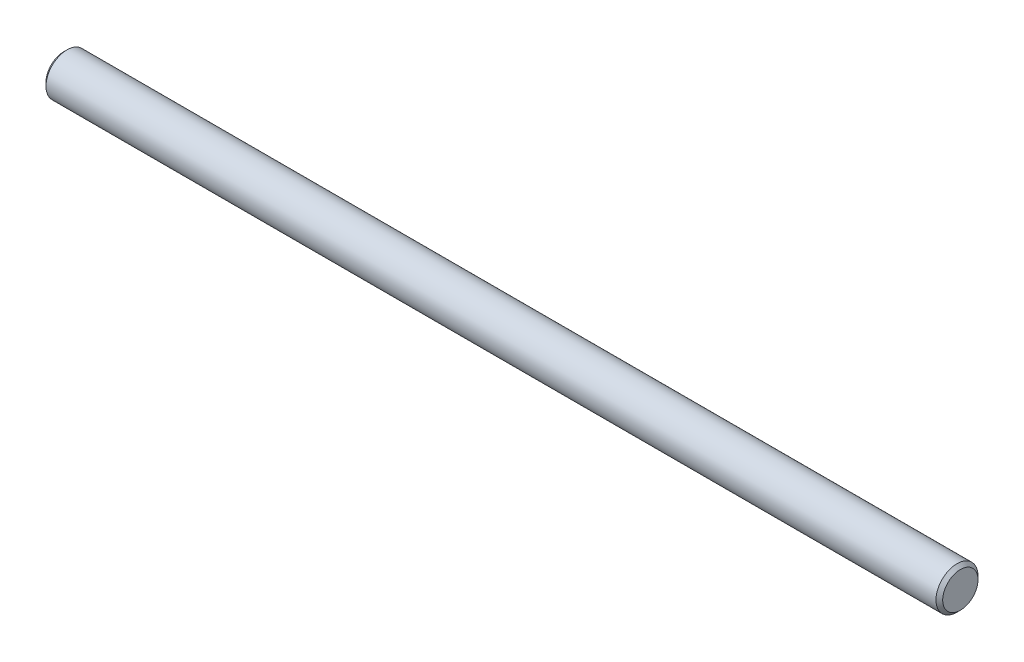
ISO-10303-21;
HEADER;
FILE_DESCRIPTION(('STEP AP214'),'2;1');
FILE_NAME('part.step','',(''),(''),'','','');
FILE_SCHEMA(('AUTOMOTIVE_DESIGN { 1 0 10303 214 1 1 1 1 }'));
ENDSEC;
DATA;
#1=APPLICATION_CONTEXT('core data for automotive mechanical design processes');
#2=APPLICATION_PROTOCOL_DEFINITION('international standard','automotive_design',2000,#1);
#3=PRODUCT_CONTEXT('',#1,'mechanical');
#4=PRODUCT('Part','Part','',(#3));
#5=PRODUCT_RELATED_PRODUCT_CATEGORY('part','',(#4));
#6=PRODUCT_DEFINITION_FORMATION('','',#4);
#7=PRODUCT_DEFINITION_CONTEXT('part definition',#1,'design');
#8=PRODUCT_DEFINITION('design','',#6,#7);
#9=PRODUCT_DEFINITION_SHAPE('','',#8);
#10=(LENGTH_UNIT() NAMED_UNIT(*) SI_UNIT(.MILLI.,.METRE.));
#11=(NAMED_UNIT(*) PLANE_ANGLE_UNIT() SI_UNIT($,.RADIAN.));
#12=(NAMED_UNIT(*) SI_UNIT($,.STERADIAN.) SOLID_ANGLE_UNIT());
#13=UNCERTAINTY_MEASURE_WITH_UNIT(LENGTH_MEASURE(1.E-05),#10,'distance_accuracy_value','');
#14=(GEOMETRIC_REPRESENTATION_CONTEXT(3) GLOBAL_UNCERTAINTY_ASSIGNED_CONTEXT((#13)) GLOBAL_UNIT_ASSIGNED_CONTEXT((#10,
#11,#12)) REPRESENTATION_CONTEXT('',''));
#15=CARTESIAN_POINT('',(0.,0.,0.));
#16=DIRECTION('',(0.,0.,1.));
#17=DIRECTION('',(1.,0.,0.));
#18=AXIS2_PLACEMENT_3D('',#15,#16,#17);
#19=CARTESIAN_POINT('',(50.8,0.,0.));
#20=DIRECTION('',(-1.,0.,0.));
#21=DIRECTION('',(0.,0.,1.));
#22=AXIS2_PLACEMENT_3D('',#19,#20,#21);
#23=CYLINDRICAL_SURFACE('',#22,2.38125);
#24=CARTESIAN_POINT('',(50.419,0.,0.));
#25=DIRECTION('',(1.,0.,0.));
#26=DIRECTION('',(0.,0.,-1.));
#27=AXIS2_PLACEMENT_3D('',#24,#25,#26);
#28=CIRCLE('',#27,2.38125);
#29=CARTESIAN_POINT('',(50.419,0.,-2.38125));
#30=VERTEX_POINT('',#29);
#31=EDGE_CURVE('E34',#30,#30,#28,.F.);
#32=ORIENTED_EDGE('',*,*,#31,.T.);
#33=EDGE_LOOP('',(#32));
#34=FACE_BOUND('',#33,.T.);
#35=CARTESIAN_POINT('',(-50.419,0.,0.));
#36=DIRECTION('',(1.,0.,0.));
#37=DIRECTION('',(0.,0.,-1.));
#38=AXIS2_PLACEMENT_3D('',#35,#36,#37);
#39=CIRCLE('',#38,2.38125);
#40=CARTESIAN_POINT('',(-50.419,0.,-2.38125));
#41=VERTEX_POINT('',#40);
#42=EDGE_CURVE('E38',#41,#41,#39,.T.);
#43=ORIENTED_EDGE('',*,*,#42,.T.);
#44=EDGE_LOOP('',(#43));
#45=FACE_BOUND('',#44,.T.);
#46=ADVANCED_FACE('F28',(#34,#45),#23,.T.);
#47=CARTESIAN_POINT('',(50.8,0.,0.));
#48=DIRECTION('',(1.,0.,0.));
#49=DIRECTION('',(0.,0.,-1.));
#50=AXIS2_PLACEMENT_3D('',#47,#48,#49);
#51=PLANE('',#50);
#52=CARTESIAN_POINT('',(50.8,0.,0.));
#53=DIRECTION('',(1.,0.,0.));
#54=DIRECTION('',(0.,0.,-1.));
#55=AXIS2_PLACEMENT_3D('',#52,#53,#54);
#56=CIRCLE('',#55,2.00025);
#57=CARTESIAN_POINT('',(50.8,0.,-2.00025));
#58=VERTEX_POINT('',#57);
#59=EDGE_CURVE('E42',#58,#58,#56,.T.);
#60=ORIENTED_EDGE('',*,*,#59,.T.);
#61=EDGE_LOOP('',(#60));
#62=FACE_BOUND('',#61,.T.);
#63=ADVANCED_FACE('F48',(#62),#51,.T.);
#64=CARTESIAN_POINT('',(-50.8,0.,0.));
#65=DIRECTION('',(1.,0.,0.));
#66=DIRECTION('',(0.,0.,-1.));
#67=AXIS2_PLACEMENT_3D('',#64,#65,#66);
#68=PLANE('',#67);
#69=CARTESIAN_POINT('',(-50.8,0.,0.));
#70=DIRECTION('',(1.,0.,0.));
#71=DIRECTION('',(0.,0.,-1.));
#72=AXIS2_PLACEMENT_3D('',#69,#70,#71);
#73=CIRCLE('',#72,2.00025);
#74=CARTESIAN_POINT('',(-50.8,0.,-2.00024999999999));
#75=VERTEX_POINT('',#74);
#76=EDGE_CURVE('E10',#75,#75,#73,.F.);
#77=ORIENTED_EDGE('',*,*,#76,.T.);
#78=EDGE_LOOP('',(#77));
#79=FACE_BOUND('',#78,.T.);
#80=ADVANCED_FACE('F53',(#79),#68,.F.);
#81=CARTESIAN_POINT('',(50.8,0.,0.));
#82=DIRECTION('',(-1.,0.,0.));
#83=DIRECTION('',(0.,0.,1.));
#84=AXIS2_PLACEMENT_3D('',#81,#82,#83);
#85=CONICAL_SURFACE('',#84,2.00025,0.785398163397448);
#86=ORIENTED_EDGE('',*,*,#31,.F.);
#87=EDGE_LOOP('',(#86));
#88=FACE_BOUND('',#87,.T.);
#89=ORIENTED_EDGE('',*,*,#59,.F.);
#90=EDGE_LOOP('',(#89));
#91=FACE_BOUND('',#90,.T.);
#92=ADVANCED_FACE('F50',(#88,#91),#85,.T.);
#93=CARTESIAN_POINT('',(-50.419,0.,0.));
#94=DIRECTION('',(1.,0.,0.));
#95=DIRECTION('',(0.,0.,-1.));
#96=AXIS2_PLACEMENT_3D('',#93,#94,#95);
#97=CONICAL_SURFACE('',#96,2.38125,0.785398163397446);
#98=CARTESIAN_POINT('',(-50.8,0.,-2.00024999999999));
#99=CARTESIAN_POINT('',(-50.79603125,0.,-2.00421874999999));
#100=CARTESIAN_POINT('',(-50.7920625,0.,-2.00818749999999));
#101=CARTESIAN_POINT('',(-50.784125,0.,-2.01612499999999));
#102=CARTESIAN_POINT('',(-50.78015625,0.,-2.02009374999999));
#103=CARTESIAN_POINT('',(-50.77221875,0.,-2.02803124999999));
#104=CARTESIAN_POINT('',(-50.76825,0.,-2.03199999999999));
#105=CARTESIAN_POINT('',(-50.7603125,0.,-2.03993749999999));
#106=CARTESIAN_POINT('',(-50.75634375,0.,-2.04390624999999));
#107=CARTESIAN_POINT('',(-50.74840625,0.,-2.05184374999999));
#108=CARTESIAN_POINT('',(-50.7444375,0.,-2.05581249999999));
#109=CARTESIAN_POINT('',(-50.7365,0.,-2.06374999999999));
#110=CARTESIAN_POINT('',(-50.73253125,0.,-2.06771874999999));
#111=CARTESIAN_POINT('',(-50.72459375,0.,-2.07565624999999));
#112=CARTESIAN_POINT('',(-50.720625,0.,-2.07962499999999));
#113=CARTESIAN_POINT('',(-50.7126875,0.,-2.08756249999999));
#114=CARTESIAN_POINT('',(-50.70871875,0.,-2.09153124999999));
#115=CARTESIAN_POINT('',(-50.70078125,0.,-2.09946874999999));
#116=CARTESIAN_POINT('',(-50.6968125,0.,-2.10343749999999));
#117=CARTESIAN_POINT('',(-50.688875,0.,-2.11137499999999));
#118=CARTESIAN_POINT('',(-50.68490625,0.,-2.11534374999999));
#119=CARTESIAN_POINT('',(-50.67696875,0.,-2.12328124999999));
#120=CARTESIAN_POINT('',(-50.673,0.,-2.12724999999999));
#121=CARTESIAN_POINT('',(-50.6650625,0.,-2.13518749999999));
#122=CARTESIAN_POINT('',(-50.66109375,0.,-2.13915624999999));
#123=CARTESIAN_POINT('',(-50.65315625,0.,-2.14709374999999));
#124=CARTESIAN_POINT('',(-50.6491875,0.,-2.15106249999999));
#125=CARTESIAN_POINT('',(-50.64125,0.,-2.15899999999999));
#126=CARTESIAN_POINT('',(-50.63728125,0.,-2.16296874999999));
#127=CARTESIAN_POINT('',(-50.62934375,0.,-2.17090624999999));
#128=CARTESIAN_POINT('',(-50.625375,0.,-2.17487499999999));
#129=CARTESIAN_POINT('',(-50.6174375,0.,-2.18281249999999));
#130=CARTESIAN_POINT('',(-50.61346875,0.,-2.18678124999999));
#131=CARTESIAN_POINT('',(-50.60553125,0.,-2.19471874999999));
#132=CARTESIAN_POINT('',(-50.6015625,0.,-2.19868749999999));
#133=CARTESIAN_POINT('',(-50.593625,0.,-2.20662499999999));
#134=CARTESIAN_POINT('',(-50.58965625,0.,-2.21059374999999));
#135=CARTESIAN_POINT('',(-50.58171875,0.,-2.21853124999999));
#136=CARTESIAN_POINT('',(-50.57775,0.,-2.22249999999999));
#137=CARTESIAN_POINT('',(-50.5698125,0.,-2.23043749999999));
#138=CARTESIAN_POINT('',(-50.56584375,0.,-2.23440624999999));
#139=CARTESIAN_POINT('',(-50.55790625,0.,-2.24234375));
#140=CARTESIAN_POINT('',(-50.5539375,0.,-2.2463125));
#141=CARTESIAN_POINT('',(-50.546,0.,-2.25425));
#142=CARTESIAN_POINT('',(-50.54203125,0.,-2.25821874999999));
#143=CARTESIAN_POINT('',(-50.53409375,0.,-2.26615624999999));
#144=CARTESIAN_POINT('',(-50.530125,0.,-2.27012499999999));
#145=CARTESIAN_POINT('',(-50.5221875,0.,-2.2780625));
#146=CARTESIAN_POINT('',(-50.51821875,0.,-2.28203124999999));
#147=CARTESIAN_POINT('',(-50.51028125,0.,-2.28996875));
#148=CARTESIAN_POINT('',(-50.5063125,0.,-2.2939375));
#149=CARTESIAN_POINT('',(-50.498375,0.,-2.301875));
#150=CARTESIAN_POINT('',(-50.49440625,0.,-2.30584375));
#151=CARTESIAN_POINT('',(-50.48646875,0.,-2.31378125));
#152=CARTESIAN_POINT('',(-50.4825,0.,-2.31775));
#153=CARTESIAN_POINT('',(-50.4745625,0.,-2.3256875));
#154=CARTESIAN_POINT('',(-50.47059375,0.,-2.32965625));
#155=CARTESIAN_POINT('',(-50.46265625,0.,-2.33759375));
#156=CARTESIAN_POINT('',(-50.4586875,0.,-2.3415625));
#157=CARTESIAN_POINT('',(-50.45075,0.,-2.3495));
#158=CARTESIAN_POINT('',(-50.44678125,0.,-2.35346875));
#159=CARTESIAN_POINT('',(-50.43884375,0.,-2.36140625));
#160=CARTESIAN_POINT('',(-50.434875,0.,-2.365375));
#161=CARTESIAN_POINT('',(-50.4269375,0.,-2.3733125));
#162=CARTESIAN_POINT('',(-50.42296875,0.,-2.37728125));
#163=CARTESIAN_POINT('',(-50.419,0.,-2.38125));
#164=B_SPLINE_CURVE_WITH_KNOTS('',3,(#98,#99,#100,#101,#102,#103,#104,#105,#106,#107,#108,#109,
#110,#111,#112,#113,#114,#115,#116,#117,#118,#119,#120,#121,#122,#123,#124,#125,#126,#127,#128,
#129,#130,#131,#132,#133,#134,#135,#136,#137,#138,#139,#140,#141,#142,#143,#144,#145,#146,#147,
#148,#149,#150,#151,#152,#153,#154,#155,#156,#157,#158,#159,#160,#161,#162,#163),.UNSPECIFIED.,
.F.,.F.,(4,2,2,2,2,2,2,2,2,2,2,2,2,2,2,2,2,2,2,2,2,2,2,2,2,2,2,2,2,2,2,2,4),(0.,
0.0168379802270089,0.0336759604540126,0.0505139406810167,0.0673519209080207,0.0841899011350247,
0.101027881362034,0.117865861589038,0.134703841816042,0.151541822043045,0.168379802270049,
0.185217782497058,0.202055762724062,0.218893742951066,0.23573172317807,0.252569703405074,
0.269407683632078,0.286245663859087,0.303083644086091,0.319921624313095,0.336759604540099,
0.353597584767103,0.370435564994112,0.387273545221116,0.40411152544812,0.420949505675124,
0.437787485902128,0.454625466129137,0.471463446356141,0.488301426583145,0.505139406810149,
0.521977387037153,0.538815367264162),.UNSPECIFIED.);
#165=EDGE_CURVE('BSEAM52',#75,#41,#164,.T.);
#166=ORIENTED_EDGE('',*,*,#76,.F.);
#167=ORIENTED_EDGE('',*,*,#42,.F.);
#168=ORIENTED_EDGE('',*,*,#165,.T.);
#169=ORIENTED_EDGE('',*,*,#165,.F.);
#170=EDGE_LOOP('',(#166,#168,#167,#169));
#171=FACE_BOUND('',#170,.T.);
#172=ADVANCED_FACE('F52',(#171),#97,.T.);
#173=CLOSED_SHELL('',(#46,#63,#80,#92,#172));
#174=MANIFOLD_SOLID_BREP('B2',#173);
#175=ADVANCED_BREP_SHAPE_REPRESENTATION('',(#18,#174),#14);
#176=SHAPE_DEFINITION_REPRESENTATION(#9,#175);
ENDSEC;
END-ISO-10303-21;
